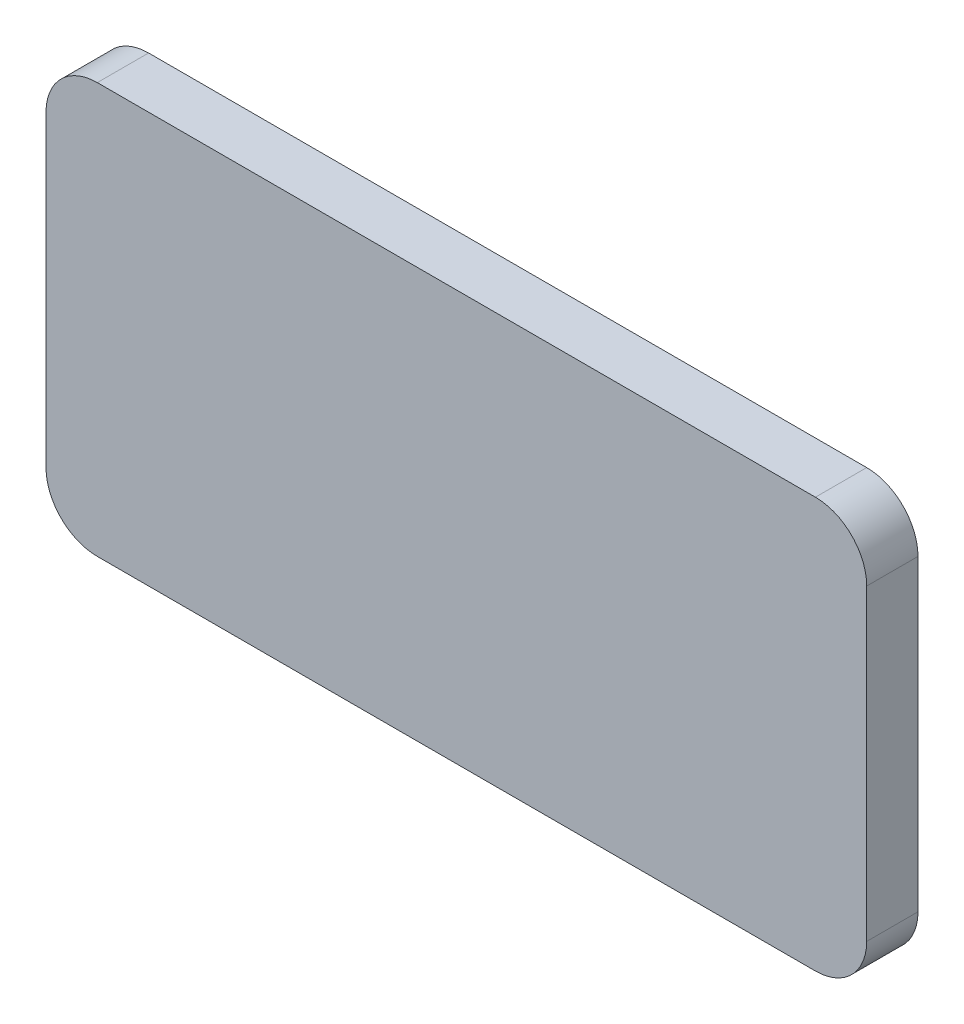
ISO-10303-21;
HEADER;
FILE_DESCRIPTION(('STEP AP214'),'2;1');
FILE_NAME('part.step','',(''),(''),'','','');
FILE_SCHEMA(('AUTOMOTIVE_DESIGN { 1 0 10303 214 1 1 1 1 }'));
ENDSEC;
DATA;
#1=APPLICATION_CONTEXT('core data for automotive mechanical design processes');
#2=APPLICATION_PROTOCOL_DEFINITION('international standard','automotive_design',2000,#1);
#3=PRODUCT_CONTEXT('',#1,'mechanical');
#4=PRODUCT('Part','Part','',(#3));
#5=PRODUCT_RELATED_PRODUCT_CATEGORY('part','',(#4));
#6=PRODUCT_DEFINITION_FORMATION('','',#4);
#7=PRODUCT_DEFINITION_CONTEXT('part definition',#1,'design');
#8=PRODUCT_DEFINITION('design','',#6,#7);
#9=PRODUCT_DEFINITION_SHAPE('','',#8);
#10=(LENGTH_UNIT() NAMED_UNIT(*) SI_UNIT(.MILLI.,.METRE.));
#11=(NAMED_UNIT(*) PLANE_ANGLE_UNIT() SI_UNIT($,.RADIAN.));
#12=(NAMED_UNIT(*) SI_UNIT($,.STERADIAN.) SOLID_ANGLE_UNIT());
#13=UNCERTAINTY_MEASURE_WITH_UNIT(LENGTH_MEASURE(1.E-05),#10,'distance_accuracy_value','');
#14=(GEOMETRIC_REPRESENTATION_CONTEXT(3) GLOBAL_UNCERTAINTY_ASSIGNED_CONTEXT((#13)) GLOBAL_UNIT_ASSIGNED_CONTEXT((#10,
#11,#12)) REPRESENTATION_CONTEXT('',''));
#15=CARTESIAN_POINT('',(0.,0.,0.));
#16=DIRECTION('',(0.,0.,1.));
#17=DIRECTION('',(1.,0.,0.));
#18=AXIS2_PLACEMENT_3D('',#15,#16,#17);
#19=CARTESIAN_POINT('',(75.0000000000002,35.0000000000001,5.00000000000056));
#20=DIRECTION('',(0.,0.,-1.));
#21=DIRECTION('',(-1.,0.,0.));
#22=AXIS2_PLACEMENT_3D('',#19,#20,#21);
#23=CYLINDRICAL_SURFACE('',#22,4.99999999999999);
#24=CARTESIAN_POINT('',(75.0000000000002,35.0000000000001,0.));
#25=DIRECTION('',(0.,0.,1.));
#26=DIRECTION('',(1.,0.,0.));
#27=AXIS2_PLACEMENT_3D('',#24,#25,#26);
#28=CIRCLE('',#27,4.99999999999999);
#29=CARTESIAN_POINT('',(80.0000000000001,35.0000000000001,-3.33066907387547E-13));
#30=VERTEX_POINT('',#29);
#31=CARTESIAN_POINT('',(75.0000000000002,40.,-8.88178419700125E-13));
#32=VERTEX_POINT('',#31);
#33=EDGE_CURVE('E134',#30,#32,#28,.T.);
#34=ORIENTED_EDGE('',*,*,#33,.T.);
#35=DIRECTION('',(0.,0.,-1.));
#36=VECTOR('',#35,1.);
#37=CARTESIAN_POINT('',(75.0000000000002,40.,5.00000000000056));
#38=LINE('',#37,#36);
#39=CARTESIAN_POINT('',(75.0000000000002,40.,5.00000000000056));
#40=VERTEX_POINT('',#39);
#41=EDGE_CURVE('E11',#40,#32,#38,.T.);
#42=ORIENTED_EDGE('',*,*,#41,.F.);
#43=CARTESIAN_POINT('',(75.0000000000002,35.0000000000001,5.00000000000056));
#44=DIRECTION('',(0.,0.,1.));
#45=DIRECTION('',(1.,0.,0.));
#46=AXIS2_PLACEMENT_3D('',#43,#44,#45);
#47=CIRCLE('',#46,4.99999999999999);
#48=CARTESIAN_POINT('',(80.0000000000001,35.0000000000001,5.00000000000056));
#49=VERTEX_POINT('',#48);
#50=EDGE_CURVE('E148',#49,#40,#47,.T.);
#51=ORIENTED_EDGE('',*,*,#50,.F.);
#52=DIRECTION('',(0.,0.,-1.));
#53=VECTOR('',#52,1.);
#54=CARTESIAN_POINT('',(80.0000000000001,35.0000000000001,5.00000000000056));
#55=LINE('',#54,#53);
#56=EDGE_CURVE('E130',#49,#30,#55,.T.);
#57=ORIENTED_EDGE('',*,*,#56,.T.);
#58=EDGE_LOOP('',(#34,#42,#51,#57));
#59=FACE_BOUND('',#58,.T.);
#60=ADVANCED_FACE('F38',(#59),#23,.T.);
#61=CARTESIAN_POINT('',(4.99999999999989,40.,5.00000000000056));
#62=DIRECTION('',(0.,-1.,0.));
#63=DIRECTION('',(0.,0.,-1.));
#64=AXIS2_PLACEMENT_3D('',#61,#62,#63);
#65=PLANE('',#64);
#66=DIRECTION('',(-1.,0.,0.));
#67=VECTOR('',#66,1.);
#68=CARTESIAN_POINT('',(4.99999999999989,40.,0.));
#69=LINE('',#68,#67);
#70=CARTESIAN_POINT('',(4.99999999999989,40.,0.));
#71=VERTEX_POINT('',#70);
#72=EDGE_CURVE('E137',#32,#71,#69,.T.);
#73=ORIENTED_EDGE('',*,*,#72,.T.);
#74=DIRECTION('',(0.,0.,-1.));
#75=VECTOR('',#74,1.);
#76=CARTESIAN_POINT('',(4.99999999999989,40.,5.00000000000056));
#77=LINE('',#76,#75);
#78=CARTESIAN_POINT('',(4.99999999999989,40.,5.00000000000056));
#79=VERTEX_POINT('',#78);
#80=EDGE_CURVE('E46',#79,#71,#77,.T.);
#81=ORIENTED_EDGE('',*,*,#80,.F.);
#82=DIRECTION('',(-1.,0.,0.));
#83=VECTOR('',#82,1.);
#84=CARTESIAN_POINT('',(4.99999999999989,40.,5.00000000000056));
#85=LINE('',#84,#83);
#86=EDGE_CURVE('E97',#40,#79,#85,.T.);
#87=ORIENTED_EDGE('',*,*,#86,.F.);
#88=ORIENTED_EDGE('',*,*,#41,.T.);
#89=EDGE_LOOP('',(#73,#81,#87,#88));
#90=FACE_BOUND('',#89,.T.);
#91=ADVANCED_FACE('F183',(#90),#65,.F.);
#92=CARTESIAN_POINT('',(4.99999999999989,35.0000000000001,5.00000000000056));
#93=DIRECTION('',(0.,0.,-1.));
#94=DIRECTION('',(-1.,0.,0.));
#95=AXIS2_PLACEMENT_3D('',#92,#93,#94);
#96=CYLINDRICAL_SURFACE('',#95,5.);
#97=CARTESIAN_POINT('',(4.99999999999989,35.0000000000001,0.));
#98=DIRECTION('',(0.,0.,1.));
#99=DIRECTION('',(-1.,0.,0.));
#100=AXIS2_PLACEMENT_3D('',#97,#98,#99);
#101=CIRCLE('',#100,5.);
#102=CARTESIAN_POINT('',(0.,35.0000000000001,0.));
#103=VERTEX_POINT('',#102);
#104=EDGE_CURVE('E139',#71,#103,#101,.T.);
#105=ORIENTED_EDGE('',*,*,#104,.T.);
#106=DIRECTION('',(0.,0.,-1.));
#107=VECTOR('',#106,1.);
#108=CARTESIAN_POINT('',(0.,35.0000000000001,4.99999999999989));
#109=LINE('',#108,#107);
#110=CARTESIAN_POINT('',(0.,35.0000000000001,4.99999999999989));
#111=VERTEX_POINT('',#110);
#112=EDGE_CURVE('E155',#111,#103,#109,.T.);
#113=ORIENTED_EDGE('',*,*,#112,.F.);
#114=CARTESIAN_POINT('',(4.99999999999989,35.0000000000001,5.00000000000056));
#115=DIRECTION('',(0.,0.,1.));
#116=DIRECTION('',(-1.,0.,0.));
#117=AXIS2_PLACEMENT_3D('',#114,#115,#116);
#118=CIRCLE('',#117,5.);
#119=EDGE_CURVE('E163',#79,#111,#118,.T.);
#120=ORIENTED_EDGE('',*,*,#119,.F.);
#121=ORIENTED_EDGE('',*,*,#80,.T.);
#122=EDGE_LOOP('',(#105,#113,#120,#121));
#123=FACE_BOUND('',#122,.T.);
#124=ADVANCED_FACE('F161',(#123),#96,.T.);
#125=CARTESIAN_POINT('',(0.,4.99999999999989,4.99999999999834));
#126=DIRECTION('',(1.,0.,0.));
#127=DIRECTION('',(0.,0.,-1.));
#128=AXIS2_PLACEMENT_3D('',#125,#126,#127);
#129=PLANE('',#128);
#130=DIRECTION('',(0.,-1.,0.));
#131=VECTOR('',#130,1.);
#132=CARTESIAN_POINT('',(0.,4.99999999999989,0.));
#133=LINE('',#132,#131);
#134=CARTESIAN_POINT('',(0.,4.99999999999989,0.));
#135=VERTEX_POINT('',#134);
#136=EDGE_CURVE('E141',#103,#135,#133,.T.);
#137=ORIENTED_EDGE('',*,*,#136,.T.);
#138=DIRECTION('',(0.,0.,-1.));
#139=VECTOR('',#138,1.);
#140=CARTESIAN_POINT('',(0.,4.99999999999989,4.99999999999834));
#141=LINE('',#140,#139);
#142=CARTESIAN_POINT('',(0.,4.99999999999989,4.99999999999834));
#143=VERTEX_POINT('',#142);
#144=EDGE_CURVE('E152',#143,#135,#141,.T.);
#145=ORIENTED_EDGE('',*,*,#144,.F.);
#146=DIRECTION('',(0.,-1.,0.));
#147=VECTOR('',#146,1.);
#148=CARTESIAN_POINT('',(0.,4.99999999999989,4.99999999999834));
#149=LINE('',#148,#147);
#150=EDGE_CURVE('E175',#111,#143,#149,.T.);
#151=ORIENTED_EDGE('',*,*,#150,.F.);
#152=ORIENTED_EDGE('',*,*,#112,.T.);
#153=EDGE_LOOP('',(#137,#145,#151,#152));
#154=FACE_BOUND('',#153,.T.);
#155=ADVANCED_FACE('F171',(#154),#129,.F.);
#156=CARTESIAN_POINT('',(4.99999999999989,4.99999999999989,4.99999999999901));
#157=DIRECTION('',(0.,0.,-1.));
#158=DIRECTION('',(-1.,0.,0.));
#159=AXIS2_PLACEMENT_3D('',#156,#157,#158);
#160=CYLINDRICAL_SURFACE('',#159,5.);
#161=CARTESIAN_POINT('',(4.99999999999989,4.99999999999989,0.));
#162=DIRECTION('',(0.,0.,1.));
#163=DIRECTION('',(-1.,0.,0.));
#164=AXIS2_PLACEMENT_3D('',#161,#162,#163);
#165=CIRCLE('',#164,5.);
#166=CARTESIAN_POINT('',(4.99999999999989,0.,0.));
#167=VERTEX_POINT('',#166);
#168=EDGE_CURVE('E143',#135,#167,#165,.T.);
#169=ORIENTED_EDGE('',*,*,#168,.T.);
#170=DIRECTION('',(0.,0.,-1.));
#171=VECTOR('',#170,1.);
#172=CARTESIAN_POINT('',(4.99999999999989,0.,4.99999999999901));
#173=LINE('',#172,#171);
#174=CARTESIAN_POINT('',(4.99999999999989,0.,4.99999999999901));
#175=VERTEX_POINT('',#174);
#176=EDGE_CURVE('E125',#175,#167,#173,.T.);
#177=ORIENTED_EDGE('',*,*,#176,.F.);
#178=CARTESIAN_POINT('',(4.99999999999989,4.99999999999989,4.99999999999901));
#179=DIRECTION('',(0.,0.,1.));
#180=DIRECTION('',(-1.,0.,0.));
#181=AXIS2_PLACEMENT_3D('',#178,#179,#180);
#182=CIRCLE('',#181,5.);
#183=EDGE_CURVE('E116',#143,#175,#182,.T.);
#184=ORIENTED_EDGE('',*,*,#183,.F.);
#185=ORIENTED_EDGE('',*,*,#144,.T.);
#186=EDGE_LOOP('',(#169,#177,#184,#185));
#187=FACE_BOUND('',#186,.T.);
#188=ADVANCED_FACE('F174',(#187),#160,.T.);
#189=CARTESIAN_POINT('',(4.99999999999989,0.,4.99999999999901));
#190=DIRECTION('',(0.,1.,0.));
#191=DIRECTION('',(0.,0.,1.));
#192=AXIS2_PLACEMENT_3D('',#189,#190,#191);
#193=PLANE('',#192);
#194=DIRECTION('',(1.,0.,0.));
#195=VECTOR('',#194,1.);
#196=CARTESIAN_POINT('',(4.99999999999989,0.,0.));
#197=LINE('',#196,#195);
#198=CARTESIAN_POINT('',(75.0000000000002,0.,0.));
#199=VERTEX_POINT('',#198);
#200=EDGE_CURVE('E124',#167,#199,#197,.T.);
#201=ORIENTED_EDGE('',*,*,#200,.T.);
#202=DIRECTION('',(0.,0.,-1.));
#203=VECTOR('',#202,1.);
#204=CARTESIAN_POINT('',(75.0000000000002,0.,4.99999999999901));
#205=LINE('',#204,#203);
#206=CARTESIAN_POINT('',(75.0000000000002,0.,4.99999999999901));
#207=VERTEX_POINT('',#206);
#208=EDGE_CURVE('E121',#207,#199,#205,.T.);
#209=ORIENTED_EDGE('',*,*,#208,.F.);
#210=DIRECTION('',(1.,0.,0.));
#211=VECTOR('',#210,1.);
#212=CARTESIAN_POINT('',(4.99999999999989,0.,4.99999999999901));
#213=LINE('',#212,#211);
#214=EDGE_CURVE('E110',#175,#207,#213,.T.);
#215=ORIENTED_EDGE('',*,*,#214,.F.);
#216=ORIENTED_EDGE('',*,*,#176,.T.);
#217=EDGE_LOOP('',(#201,#209,#215,#216));
#218=FACE_BOUND('',#217,.T.);
#219=ADVANCED_FACE('F122',(#218),#193,.F.);
#220=CARTESIAN_POINT('',(75.0000000000002,4.99999999999989,4.99999999999901));
#221=DIRECTION('',(0.,0.,-1.));
#222=DIRECTION('',(-1.,0.,0.));
#223=AXIS2_PLACEMENT_3D('',#220,#221,#222);
#224=CYLINDRICAL_SURFACE('',#223,5.00000000000001);
#225=CARTESIAN_POINT('',(75.0000000000002,4.99999999999989,-8.88178419700125E-13));
#226=DIRECTION('',(0.,0.,1.));
#227=DIRECTION('',(1.,0.,0.));
#228=AXIS2_PLACEMENT_3D('',#225,#226,#227);
#229=CIRCLE('',#228,5.00000000000001);
#230=CARTESIAN_POINT('',(80.0000000000001,4.99999999999989,-3.33066907387547E-13));
#231=VERTEX_POINT('',#230);
#232=EDGE_CURVE('E83',#199,#231,#229,.T.);
#233=ORIENTED_EDGE('',*,*,#232,.T.);
#234=DIRECTION('',(0.,0.,-1.));
#235=VECTOR('',#234,1.);
#236=CARTESIAN_POINT('',(80.0000000000001,4.99999999999989,4.99999999999901));
#237=LINE('',#236,#235);
#238=CARTESIAN_POINT('',(80.0000000000001,4.99999999999989,4.99999999999901));
#239=VERTEX_POINT('',#238);
#240=EDGE_CURVE('E126',#239,#231,#237,.T.);
#241=ORIENTED_EDGE('',*,*,#240,.F.);
#242=CARTESIAN_POINT('',(75.0000000000002,4.99999999999989,4.99999999999901));
#243=DIRECTION('',(0.,0.,1.));
#244=DIRECTION('',(1.,0.,0.));
#245=AXIS2_PLACEMENT_3D('',#242,#243,#244);
#246=CIRCLE('',#245,5.00000000000001);
#247=EDGE_CURVE('E114',#207,#239,#246,.T.);
#248=ORIENTED_EDGE('',*,*,#247,.F.);
#249=ORIENTED_EDGE('',*,*,#208,.T.);
#250=EDGE_LOOP('',(#233,#241,#248,#249));
#251=FACE_BOUND('',#250,.T.);
#252=ADVANCED_FACE('F128',(#251),#224,.T.);
#253=CARTESIAN_POINT('',(80.0000000000001,4.99999999999989,4.99999999999901));
#254=DIRECTION('',(-1.,0.,0.));
#255=DIRECTION('',(0.,-1.,0.));
#256=AXIS2_PLACEMENT_3D('',#253,#254,#255);
#257=PLANE('',#256);
#258=DIRECTION('',(0.,1.,0.));
#259=VECTOR('',#258,1.);
#260=CARTESIAN_POINT('',(80.0000000000001,4.99999999999989,-3.33066907387547E-13));
#261=LINE('',#260,#259);
#262=EDGE_CURVE('E89',#231,#30,#261,.T.);
#263=ORIENTED_EDGE('',*,*,#262,.T.);
#264=ORIENTED_EDGE('',*,*,#56,.F.);
#265=DIRECTION('',(0.,1.,0.));
#266=VECTOR('',#265,1.);
#267=CARTESIAN_POINT('',(80.0000000000001,4.99999999999989,4.99999999999901));
#268=LINE('',#267,#266);
#269=EDGE_CURVE('E54',#239,#49,#268,.T.);
#270=ORIENTED_EDGE('',*,*,#269,.F.);
#271=ORIENTED_EDGE('',*,*,#240,.T.);
#272=EDGE_LOOP('',(#263,#264,#270,#271));
#273=FACE_BOUND('',#272,.T.);
#274=ADVANCED_FACE('F199',(#273),#257,.F.);
#275=CARTESIAN_POINT('',(75.0000000000002,35.0000000000001,5.00000000000056));
#276=DIRECTION('',(0.,0.,1.));
#277=DIRECTION('',(1.,0.,0.));
#278=AXIS2_PLACEMENT_3D('',#275,#276,#277);
#279=PLANE('',#278);
#280=ORIENTED_EDGE('',*,*,#50,.T.);
#281=ORIENTED_EDGE('',*,*,#86,.T.);
#282=ORIENTED_EDGE('',*,*,#119,.T.);
#283=ORIENTED_EDGE('',*,*,#150,.T.);
#284=ORIENTED_EDGE('',*,*,#183,.T.);
#285=ORIENTED_EDGE('',*,*,#214,.T.);
#286=ORIENTED_EDGE('',*,*,#247,.T.);
#287=ORIENTED_EDGE('',*,*,#269,.T.);
#288=EDGE_LOOP('',(#280,#281,#282,#283,#284,#285,#286,#287));
#289=FACE_BOUND('',#288,.T.);
#290=ADVANCED_FACE('F112',(#289),#279,.T.);
#291=CARTESIAN_POINT('',(75.0000000000002,35.0000000000001,0.));
#292=DIRECTION('',(0.,0.,1.));
#293=DIRECTION('',(1.,0.,0.));
#294=AXIS2_PLACEMENT_3D('',#291,#292,#293);
#295=PLANE('',#294);
#296=ORIENTED_EDGE('',*,*,#33,.F.);
#297=ORIENTED_EDGE('',*,*,#262,.F.);
#298=ORIENTED_EDGE('',*,*,#232,.F.);
#299=ORIENTED_EDGE('',*,*,#200,.F.);
#300=ORIENTED_EDGE('',*,*,#168,.F.);
#301=ORIENTED_EDGE('',*,*,#136,.F.);
#302=ORIENTED_EDGE('',*,*,#104,.F.);
#303=ORIENTED_EDGE('',*,*,#72,.F.);
#304=EDGE_LOOP('',(#296,#297,#298,#299,#300,#301,#302,#303));
#305=FACE_BOUND('',#304,.T.);
#306=ADVANCED_FACE('F167',(#305),#295,.F.);
#307=CLOSED_SHELL('',(#60,#91,#124,#155,#188,#219,#252,#274,#290,#306));
#308=MANIFOLD_SOLID_BREP('B2',#307);
#309=ADVANCED_BREP_SHAPE_REPRESENTATION('',(#18,#308),#14);
#310=SHAPE_DEFINITION_REPRESENTATION(#9,#309);
ENDSEC;
END-ISO-10303-21;
